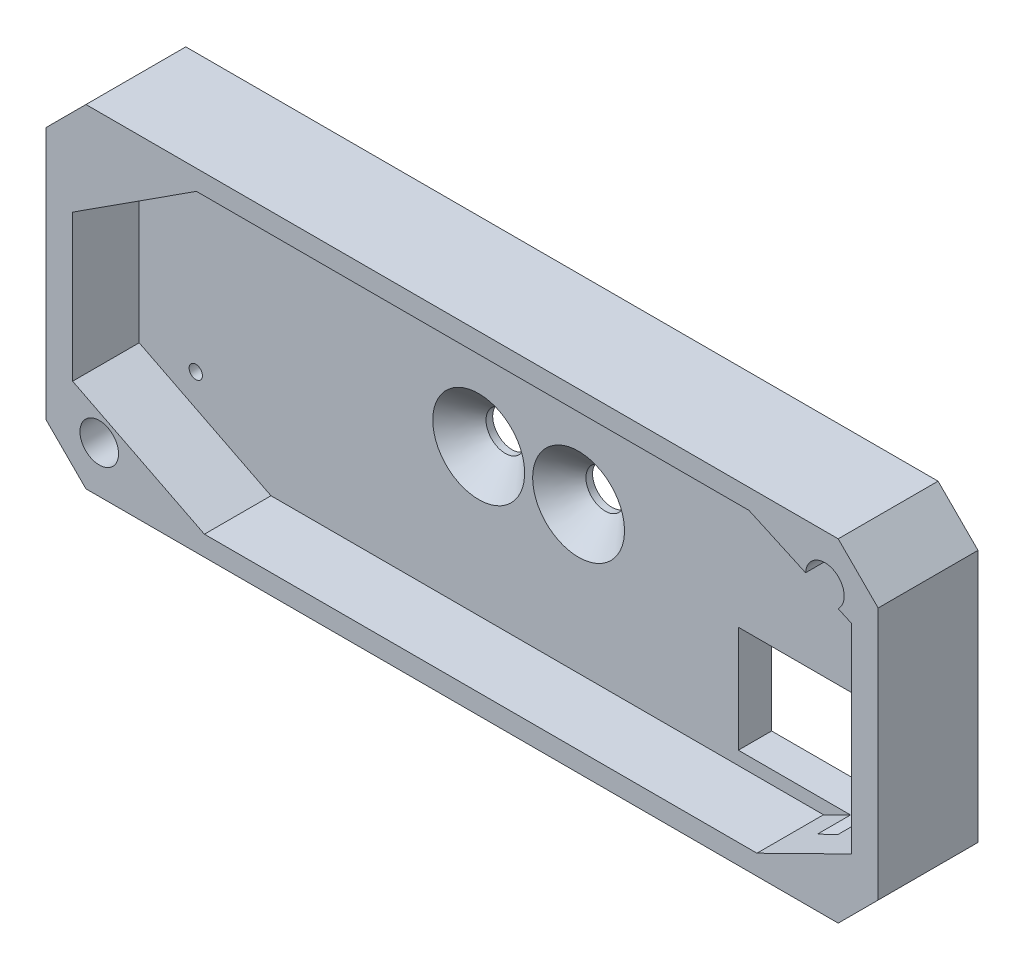
ISO-10303-21;
HEADER;
FILE_DESCRIPTION(('STEP AP214'),'2;1');
FILE_NAME('part.step','',(''),(''),'','','');
FILE_SCHEMA(('AUTOMOTIVE_DESIGN { 1 0 10303 214 1 1 1 1 }'));
ENDSEC;
DATA;
#1=APPLICATION_CONTEXT('core data for automotive mechanical design processes');
#2=APPLICATION_PROTOCOL_DEFINITION('international standard','automotive_design',2000,#1);
#3=PRODUCT_CONTEXT('',#1,'mechanical');
#4=PRODUCT('Part','Part','',(#3));
#5=PRODUCT_RELATED_PRODUCT_CATEGORY('part','',(#4));
#6=PRODUCT_DEFINITION_FORMATION('','',#4);
#7=PRODUCT_DEFINITION_CONTEXT('part definition',#1,'design');
#8=PRODUCT_DEFINITION('design','',#6,#7);
#9=PRODUCT_DEFINITION_SHAPE('','',#8);
#10=(LENGTH_UNIT() NAMED_UNIT(*) SI_UNIT(.MILLI.,.METRE.));
#11=(NAMED_UNIT(*) PLANE_ANGLE_UNIT() SI_UNIT($,.RADIAN.));
#12=(NAMED_UNIT(*) SI_UNIT($,.STERADIAN.) SOLID_ANGLE_UNIT());
#13=UNCERTAINTY_MEASURE_WITH_UNIT(LENGTH_MEASURE(1.E-05),#10,'distance_accuracy_value','');
#14=(GEOMETRIC_REPRESENTATION_CONTEXT(3) GLOBAL_UNCERTAINTY_ASSIGNED_CONTEXT((#13)) GLOBAL_UNIT_ASSIGNED_CONTEXT((#10,
#11,#12)) REPRESENTATION_CONTEXT('',''));
#15=CARTESIAN_POINT('',(0.,0.,0.));
#16=DIRECTION('',(0.,0.,1.));
#17=DIRECTION('',(1.,0.,0.));
#18=AXIS2_PLACEMENT_3D('',#15,#16,#17);
#19=CARTESIAN_POINT('',(21.55,11.,7.5));
#20=DIRECTION('',(-0.413802944301184,-0.910366477462605,0.));
#21=DIRECTION('',(0.910366477462605,-0.413802944301184,0.));
#22=AXIS2_PLACEMENT_3D('',#19,#20,#21);
#23=PLANE('',#22);
#24=DIRECTION('',(0.,0.,1.));
#25=VECTOR('',#24,1.);
#26=CARTESIAN_POINT('',(28.2532240403706,7.95307998164974,-2.5));
#27=LINE('',#26,#25);
#28=CARTESIAN_POINT('',(28.2532240403706,7.95307998164974,2.5));
#29=VERTEX_POINT('',#28);
#30=CARTESIAN_POINT('',(28.2532240403706,7.95307998164974,7.5));
#31=VERTEX_POINT('',#30);
#32=EDGE_CURVE('E11',#29,#31,#27,.T.);
#33=ORIENTED_EDGE('',*,*,#32,.F.);
#34=DIRECTION('',(-0.910366477462605,0.413802944301184,0.));
#35=VECTOR('',#34,1.);
#36=CARTESIAN_POINT('',(21.55,11.,2.5));
#37=LINE('',#36,#35);
#38=CARTESIAN_POINT('',(29.25,7.5,2.5));
#39=VERTEX_POINT('',#38);
#40=EDGE_CURVE('E255',#39,#29,#37,.T.);
#41=ORIENTED_EDGE('',*,*,#40,.F.);
#42=DIRECTION('',(0.,0.,-1.));
#43=VECTOR('',#42,1.);
#44=CARTESIAN_POINT('',(29.25,7.5,7.5));
#45=LINE('',#44,#43);
#46=CARTESIAN_POINT('',(29.25,7.5,7.5));
#47=VERTEX_POINT('',#46);
#48=EDGE_CURVE('E226',#47,#39,#45,.T.);
#49=ORIENTED_EDGE('',*,*,#48,.F.);
#50=DIRECTION('',(-0.910366477462605,0.413802944301184,0.));
#51=VECTOR('',#50,1.);
#52=CARTESIAN_POINT('',(21.55,11.,7.5));
#53=LINE('',#52,#51);
#54=EDGE_CURVE('E219',#47,#31,#53,.T.);
#55=ORIENTED_EDGE('',*,*,#54,.T.);
#56=EDGE_LOOP('',(#33,#41,#49,#55));
#57=FACE_BOUND('',#56,.T.);
#58=ADVANCED_FACE('F47',(#57),#23,.T.);
#59=CARTESIAN_POINT('',(31.25,-12.5,2.5));
#60=DIRECTION('',(-1.,0.,0.));
#61=DIRECTION('',(0.,0.,1.));
#62=AXIS2_PLACEMENT_3D('',#59,#60,#61);
#63=PLANE('',#62);
#64=DIRECTION('',(0.,0.,1.));
#65=VECTOR('',#64,1.);
#66=CARTESIAN_POINT('',(31.25,9.49999999999999,-2.5));
#67=LINE('',#66,#65);
#68=CARTESIAN_POINT('',(31.25,9.49999999999999,0.));
#69=VERTEX_POINT('',#68);
#70=CARTESIAN_POINT('',(31.25,9.49999999999999,7.5));
#71=VERTEX_POINT('',#70);
#72=EDGE_CURVE('E456',#69,#71,#67,.T.);
#73=ORIENTED_EDGE('',*,*,#72,.T.);
#74=DIRECTION('',(0.,1.,0.));
#75=VECTOR('',#74,1.);
#76=CARTESIAN_POINT('',(31.25,12.5,7.5));
#77=LINE('',#76,#75);
#78=CARTESIAN_POINT('',(31.25,-9.49999999999999,7.5));
#79=VERTEX_POINT('',#78);
#80=EDGE_CURVE('E290',#79,#71,#77,.T.);
#81=ORIENTED_EDGE('',*,*,#80,.F.);
#82=DIRECTION('',(0.,0.,1.));
#83=VECTOR('',#82,1.);
#84=CARTESIAN_POINT('',(31.25,-9.49999999999999,-2.5));
#85=LINE('',#84,#83);
#86=CARTESIAN_POINT('',(31.25,-9.49999999999999,0.));
#87=VERTEX_POINT('',#86);
#88=EDGE_CURVE('E454',#87,#79,#85,.T.);
#89=ORIENTED_EDGE('',*,*,#88,.F.);
#90=DIRECTION('',(0.,1.,0.));
#91=VECTOR('',#90,1.);
#92=CARTESIAN_POINT('',(31.25,-12.5,0.));
#93=LINE('',#92,#91);
#94=EDGE_CURVE('E297',#87,#69,#93,.T.);
#95=ORIENTED_EDGE('',*,*,#94,.T.);
#96=EDGE_LOOP('',(#73,#81,#89,#95));
#97=FACE_BOUND('',#96,.T.);
#98=ADVANCED_FACE('F511',(#97),#63,.F.);
#99=CARTESIAN_POINT('',(-31.25,12.5,2.5));
#100=DIRECTION('',(0.,-1.,0.));
#101=DIRECTION('',(0.,0.,-1.));
#102=AXIS2_PLACEMENT_3D('',#99,#100,#101);
#103=PLANE('',#102);
#104=DIRECTION('',(0.,0.,1.));
#105=VECTOR('',#104,1.);
#106=CARTESIAN_POINT('',(28.25,12.5,-2.5));
#107=LINE('',#106,#105);
#108=CARTESIAN_POINT('',(28.25,12.5,0.));
#109=VERTEX_POINT('',#108);
#110=CARTESIAN_POINT('',(28.25,12.5,7.5));
#111=VERTEX_POINT('',#110);
#112=EDGE_CURVE('E70',#109,#111,#107,.T.);
#113=ORIENTED_EDGE('',*,*,#112,.F.);
#114=DIRECTION('',(-1.,0.,0.));
#115=VECTOR('',#114,1.);
#116=CARTESIAN_POINT('',(-31.25,12.5,0.));
#117=LINE('',#116,#115);
#118=CARTESIAN_POINT('',(-28.25,12.5,0.));
#119=VERTEX_POINT('',#118);
#120=EDGE_CURVE('E300',#109,#119,#117,.T.);
#121=ORIENTED_EDGE('',*,*,#120,.T.);
#122=DIRECTION('',(0.,0.,1.));
#123=VECTOR('',#122,1.);
#124=CARTESIAN_POINT('',(-28.25,12.5,-2.5));
#125=LINE('',#124,#123);
#126=CARTESIAN_POINT('',(-28.25,12.5,7.5));
#127=VERTEX_POINT('',#126);
#128=EDGE_CURVE('E440',#119,#127,#125,.T.);
#129=ORIENTED_EDGE('',*,*,#128,.T.);
#130=DIRECTION('',(-1.,0.,0.));
#131=VECTOR('',#130,1.);
#132=CARTESIAN_POINT('',(-31.25,12.5,7.5));
#133=LINE('',#132,#131);
#134=EDGE_CURVE('E293',#111,#127,#133,.T.);
#135=ORIENTED_EDGE('',*,*,#134,.F.);
#136=EDGE_LOOP('',(#113,#121,#129,#135));
#137=FACE_BOUND('',#136,.T.);
#138=ADVANCED_FACE('F518',(#137),#103,.F.);
#139=CARTESIAN_POINT('',(-31.25,-12.5,2.5));
#140=DIRECTION('',(1.,0.,0.));
#141=DIRECTION('',(0.,0.,-1.));
#142=AXIS2_PLACEMENT_3D('',#139,#140,#141);
#143=PLANE('',#142);
#144=DIRECTION('',(0.,0.,1.));
#145=VECTOR('',#144,1.);
#146=CARTESIAN_POINT('',(-31.25,-9.5,-2.5));
#147=LINE('',#146,#145);
#148=CARTESIAN_POINT('',(-31.25,-9.5,0.));
#149=VERTEX_POINT('',#148);
#150=CARTESIAN_POINT('',(-31.25,-9.5,7.5));
#151=VERTEX_POINT('',#150);
#152=EDGE_CURVE('E446',#149,#151,#147,.T.);
#153=ORIENTED_EDGE('',*,*,#152,.T.);
#154=DIRECTION('',(0.,-1.,0.));
#155=VECTOR('',#154,1.);
#156=CARTESIAN_POINT('',(-31.25,12.5,7.5));
#157=LINE('',#156,#155);
#158=CARTESIAN_POINT('',(-31.25,9.49999999999998,7.5));
#159=VERTEX_POINT('',#158);
#160=EDGE_CURVE('E284',#159,#151,#157,.T.);
#161=ORIENTED_EDGE('',*,*,#160,.F.);
#162=DIRECTION('',(0.,0.,1.));
#163=VECTOR('',#162,1.);
#164=CARTESIAN_POINT('',(-31.25,9.49999999999999,-2.5));
#165=LINE('',#164,#163);
#166=CARTESIAN_POINT('',(-31.25,9.49999999999999,0.));
#167=VERTEX_POINT('',#166);
#168=EDGE_CURVE('E443',#167,#159,#165,.T.);
#169=ORIENTED_EDGE('',*,*,#168,.F.);
#170=DIRECTION('',(0.,-1.,0.));
#171=VECTOR('',#170,1.);
#172=CARTESIAN_POINT('',(-31.25,-12.5,0.));
#173=LINE('',#172,#171);
#174=EDGE_CURVE('E304',#167,#149,#173,.T.);
#175=ORIENTED_EDGE('',*,*,#174,.T.);
#176=EDGE_LOOP('',(#153,#161,#169,#175));
#177=FACE_BOUND('',#176,.T.);
#178=ADVANCED_FACE('F555',(#177),#143,.F.);
#179=CARTESIAN_POINT('',(-31.25,-12.5,2.5));
#180=DIRECTION('',(0.,1.,0.));
#181=DIRECTION('',(0.,0.,1.));
#182=AXIS2_PLACEMENT_3D('',#179,#180,#181);
#183=PLANE('',#182);
#184=DIRECTION('',(0.,0.,1.));
#185=VECTOR('',#184,1.);
#186=CARTESIAN_POINT('',(28.25,-12.5,-2.5));
#187=LINE('',#186,#185);
#188=CARTESIAN_POINT('',(28.25,-12.5,0.));
#189=VERTEX_POINT('',#188);
#190=CARTESIAN_POINT('',(28.25,-12.5,7.5));
#191=VERTEX_POINT('',#190);
#192=EDGE_CURVE('E451',#189,#191,#187,.T.);
#193=ORIENTED_EDGE('',*,*,#192,.T.);
#194=DIRECTION('',(1.,0.,0.));
#195=VECTOR('',#194,1.);
#196=CARTESIAN_POINT('',(-31.25,-12.5,7.5));
#197=LINE('',#196,#195);
#198=CARTESIAN_POINT('',(-28.25,-12.5,7.5));
#199=VERTEX_POINT('',#198);
#200=EDGE_CURVE('E287',#199,#191,#197,.T.);
#201=ORIENTED_EDGE('',*,*,#200,.F.);
#202=DIRECTION('',(0.,0.,1.));
#203=VECTOR('',#202,1.);
#204=CARTESIAN_POINT('',(-28.25,-12.5,-2.5));
#205=LINE('',#204,#203);
#206=CARTESIAN_POINT('',(-28.25,-12.5,0.));
#207=VERTEX_POINT('',#206);
#208=EDGE_CURVE('E449',#207,#199,#205,.T.);
#209=ORIENTED_EDGE('',*,*,#208,.F.);
#210=DIRECTION('',(1.,0.,0.));
#211=VECTOR('',#210,1.);
#212=CARTESIAN_POINT('',(-31.25,-12.5,0.));
#213=LINE('',#212,#211);
#214=EDGE_CURVE('E307',#207,#189,#213,.T.);
#215=ORIENTED_EDGE('',*,*,#214,.T.);
#216=EDGE_LOOP('',(#193,#201,#209,#215));
#217=FACE_BOUND('',#216,.T.);
#218=ADVANCED_FACE('F551',(#217),#183,.F.);
#219=CARTESIAN_POINT('',(0.,0.,0.));
#220=DIRECTION('',(0.,0.,-1.));
#221=DIRECTION('',(-1.,0.,0.));
#222=AXIS2_PLACEMENT_3D('',#219,#220,#221);
#223=PLANE('',#222);
#224=CARTESIAN_POINT('',(-25.,-5.76608563525223,0.));
#225=DIRECTION('',(0.,0.,-1.));
#226=DIRECTION('',(-1.,0.,0.));
#227=AXIS2_PLACEMENT_3D('',#224,#225,#226);
#228=CIRCLE('',#227,0.499999999999999);
#229=CARTESIAN_POINT('',(-25.5,-5.76608563525223,0.));
#230=VERTEX_POINT('',#229);
#231=EDGE_CURVE('E223',#230,#230,#228,.T.);
#232=ORIENTED_EDGE('',*,*,#231,.F.);
#233=EDGE_LOOP('',(#232));
#234=FACE_BOUND('',#233,.T.);
#235=CARTESIAN_POINT('',(26.5479589711327,6.00000000000001,0.));
#236=DIRECTION('',(0.,0.,-1.));
#237=DIRECTION('',(-1.,0.,0.));
#238=AXIS2_PLACEMENT_3D('',#235,#236,#237);
#239=CIRCLE('',#238,0.499999999999999);
#240=CARTESIAN_POINT('',(26.0479589711327,6.00000000000001,0.));
#241=VERTEX_POINT('',#240);
#242=EDGE_CURVE('E479',#241,#241,#239,.T.);
#243=ORIENTED_EDGE('',*,*,#242,.F.);
#244=EDGE_LOOP('',(#243));
#245=FACE_BOUND('',#244,.T.);
#246=CARTESIAN_POINT('',(-27.25,-9.,0.));
#247=DIRECTION('',(0.,0.,-1.));
#248=DIRECTION('',(-1.,0.,0.));
#249=AXIS2_PLACEMENT_3D('',#246,#247,#248);
#250=CIRCLE('',#249,1.45);
#251=CARTESIAN_POINT('',(-28.7,-9.,0.));
#252=VERTEX_POINT('',#251);
#253=EDGE_CURVE('E470',#252,#252,#250,.T.);
#254=ORIENTED_EDGE('',*,*,#253,.F.);
#255=EDGE_LOOP('',(#254));
#256=FACE_BOUND('',#255,.T.);
#257=CARTESIAN_POINT('',(27.25,9.,0.));
#258=DIRECTION('',(0.,0.,-1.));
#259=DIRECTION('',(-1.,0.,0.));
#260=AXIS2_PLACEMENT_3D('',#257,#258,#259);
#261=CIRCLE('',#260,1.45);
#262=CARTESIAN_POINT('',(25.8,9.,0.));
#263=VERTEX_POINT('',#262);
#264=EDGE_CURVE('E337',#263,#263,#261,.T.);
#265=ORIENTED_EDGE('',*,*,#264,.F.);
#266=EDGE_LOOP('',(#265));
#267=FACE_BOUND('',#266,.T.);
#268=DIRECTION('',(0.,1.,0.));
#269=VECTOR('',#268,1.);
#270=CARTESIAN_POINT('',(15.75,-2.,0.));
#271=LINE('',#270,#269);
#272=CARTESIAN_POINT('',(15.75,-10.,0.));
#273=VERTEX_POINT('',#272);
#274=CARTESIAN_POINT('',(15.75,-2.,0.));
#275=VERTEX_POINT('',#274);
#276=EDGE_CURVE('E424',#273,#275,#271,.T.);
#277=ORIENTED_EDGE('',*,*,#276,.F.);
#278=DIRECTION('',(-1.,0.,0.));
#279=VECTOR('',#278,1.);
#280=CARTESIAN_POINT('',(15.75,-10.,0.));
#281=LINE('',#280,#279);
#282=CARTESIAN_POINT('',(25.75,-10.,0.));
#283=VERTEX_POINT('',#282);
#284=EDGE_CURVE('E418',#283,#273,#281,.T.);
#285=ORIENTED_EDGE('',*,*,#284,.F.);
#286=DIRECTION('',(0.,-1.,0.));
#287=VECTOR('',#286,1.);
#288=CARTESIAN_POINT('',(25.75,-2.,0.));
#289=LINE('',#288,#287);
#290=CARTESIAN_POINT('',(25.75,-2.,0.));
#291=VERTEX_POINT('',#290);
#292=EDGE_CURVE('E421',#291,#283,#289,.T.);
#293=ORIENTED_EDGE('',*,*,#292,.F.);
#294=DIRECTION('',(1.,0.,0.));
#295=VECTOR('',#294,1.);
#296=CARTESIAN_POINT('',(15.75,-2.,0.));
#297=LINE('',#296,#295);
#298=EDGE_CURVE('E410',#275,#291,#297,.T.);
#299=ORIENTED_EDGE('',*,*,#298,.F.);
#300=EDGE_LOOP('',(#277,#285,#293,#299));
#301=FACE_BOUND('',#300,.T.);
#302=CARTESIAN_POINT('',(3.75,0.,0.));
#303=DIRECTION('',(0.,0.,-1.));
#304=DIRECTION('',(-1.,0.,0.));
#305=AXIS2_PLACEMENT_3D('',#302,#303,#304);
#306=CIRCLE('',#305,1.45);
#307=CARTESIAN_POINT('',(2.3,0.,0.));
#308=VERTEX_POINT('',#307);
#309=EDGE_CURVE('E301',#308,#308,#306,.T.);
#310=ORIENTED_EDGE('',*,*,#309,.F.);
#311=EDGE_LOOP('',(#310));
#312=FACE_BOUND('',#311,.T.);
#313=CARTESIAN_POINT('',(-3.75,0.,0.));
#314=DIRECTION('',(0.,0.,-1.));
#315=DIRECTION('',(-1.,0.,0.));
#316=AXIS2_PLACEMENT_3D('',#313,#314,#315);
#317=CIRCLE('',#316,1.45);
#318=CARTESIAN_POINT('',(-5.2,0.,0.));
#319=VERTEX_POINT('',#318);
#320=EDGE_CURVE('E296',#319,#319,#317,.T.);
#321=ORIENTED_EDGE('',*,*,#320,.F.);
#322=EDGE_LOOP('',(#321));
#323=FACE_BOUND('',#322,.T.);
#324=ORIENTED_EDGE('',*,*,#120,.F.);
#325=DIRECTION('',(0.707106781186546,-0.707106781186549,0.));
#326=VECTOR('',#325,1.);
#327=CARTESIAN_POINT('',(20.375,20.375,0.));
#328=LINE('',#327,#326);
#329=EDGE_CURVE('E426',#109,#69,#328,.T.);
#330=ORIENTED_EDGE('',*,*,#329,.T.);
#331=ORIENTED_EDGE('',*,*,#94,.F.);
#332=DIRECTION('',(-0.707106781186546,-0.707106781186549,0.));
#333=VECTOR('',#332,1.);
#334=CARTESIAN_POINT('',(20.3750000000001,-20.375,0.));
#335=LINE('',#334,#333);
#336=EDGE_CURVE('E431',#87,#189,#335,.T.);
#337=ORIENTED_EDGE('',*,*,#336,.T.);
#338=ORIENTED_EDGE('',*,*,#214,.F.);
#339=DIRECTION('',(-0.707106781186547,0.707106781186548,0.));
#340=VECTOR('',#339,1.);
#341=CARTESIAN_POINT('',(-20.375,-20.375,0.));
#342=LINE('',#341,#340);
#343=EDGE_CURVE('E434',#207,#149,#342,.T.);
#344=ORIENTED_EDGE('',*,*,#343,.T.);
#345=ORIENTED_EDGE('',*,*,#174,.F.);
#346=DIRECTION('',(0.707106781186545,0.70710678118655,0.));
#347=VECTOR('',#346,1.);
#348=CARTESIAN_POINT('',(-20.3750000000001,20.375,0.));
#349=LINE('',#348,#347);
#350=EDGE_CURVE('E437',#167,#119,#349,.T.);
#351=ORIENTED_EDGE('',*,*,#350,.T.);
#352=EDGE_LOOP('',(#324,#330,#331,#337,#338,#344,#345,#351));
#353=FACE_BOUND('',#352,.T.);
#354=ADVANCED_FACE('F539',(#234,#245,#256,#267,#301,#312,#323,#353),#223,.T.);
#355=CARTESIAN_POINT('',(0.,0.,7.5));
#356=DIRECTION('',(0.,0.,1.));
#357=DIRECTION('',(1.,0.,0.));
#358=AXIS2_PLACEMENT_3D('',#355,#356,#357);
#359=PLANE('',#358);
#360=CARTESIAN_POINT('',(-27.25,-9.,7.5));
#361=DIRECTION('',(0.,0.,1.));
#362=DIRECTION('',(1.,0.,0.));
#363=AXIS2_PLACEMENT_3D('',#360,#361,#362);
#364=CIRCLE('',#363,1.45);
#365=CARTESIAN_POINT('',(-25.8,-9.,7.5));
#366=VERTEX_POINT('',#365);
#367=EDGE_CURVE('E222',#366,#366,#364,.T.);
#368=ORIENTED_EDGE('',*,*,#367,.F.);
#369=EDGE_LOOP('',(#368));
#370=FACE_BOUND('',#369,.T.);
#371=CARTESIAN_POINT('',(27.25,9.,7.5));
#372=DIRECTION('',(0.,0.,1.));
#373=DIRECTION('',(1.,0.,0.));
#374=AXIS2_PLACEMENT_3D('',#371,#372,#373);
#375=CIRCLE('',#374,1.45);
#376=CARTESIAN_POINT('',(25.8015704801774,9.06746796355574,7.5));
#377=VERTEX_POINT('',#376);
#378=EDGE_CURVE('E62',#31,#377,#375,.T.);
#379=ORIENTED_EDGE('',*,*,#378,.F.);
#380=ORIENTED_EDGE('',*,*,#54,.F.);
#381=DIRECTION('',(0.,1.,0.));
#382=VECTOR('',#381,1.);
#383=CARTESIAN_POINT('',(29.25,7.5,7.5));
#384=LINE('',#383,#382);
#385=CARTESIAN_POINT('',(29.25,-7.5,7.5));
#386=VERTEX_POINT('',#385);
#387=EDGE_CURVE('E231',#386,#47,#384,.T.);
#388=ORIENTED_EDGE('',*,*,#387,.F.);
#389=DIRECTION('',(0.896989897320621,0.44205104242015,0.));
#390=VECTOR('',#389,1.);
#391=CARTESIAN_POINT('',(29.25,-7.5,7.5));
#392=LINE('',#391,#390);
#393=CARTESIAN_POINT('',(22.14795897,-11.,7.5));
#394=VERTEX_POINT('',#393);
#395=EDGE_CURVE('E392',#394,#386,#392,.T.);
#396=ORIENTED_EDGE('',*,*,#395,.F.);
#397=DIRECTION('',(1.,0.,0.));
#398=VECTOR('',#397,1.);
#399=CARTESIAN_POINT('',(22.14795897,-11.,7.5));
#400=LINE('',#399,#398);
#401=CARTESIAN_POINT('',(-19.35204103,-11.,7.5));
#402=VERTEX_POINT('',#401);
#403=EDGE_CURVE('E365',#402,#394,#400,.T.);
#404=ORIENTED_EDGE('',*,*,#403,.F.);
#405=DIRECTION('',(0.892579243993913,-0.450890555668728,0.));
#406=VECTOR('',#405,1.);
#407=CARTESIAN_POINT('',(-19.35204103,-11.,7.5));
#408=LINE('',#407,#406);
#409=CARTESIAN_POINT('',(-29.25,-6.,7.5));
#410=VERTEX_POINT('',#409);
#411=EDGE_CURVE('E266',#410,#402,#408,.T.);
#412=ORIENTED_EDGE('',*,*,#411,.F.);
#413=DIRECTION('',(0.,-1.,0.));
#414=VECTOR('',#413,1.);
#415=CARTESIAN_POINT('',(-29.25,-6.,7.5));
#416=LINE('',#415,#414);
#417=CARTESIAN_POINT('',(-29.25,5.,7.5));
#418=VERTEX_POINT('',#417);
#419=EDGE_CURVE('E237',#418,#410,#416,.T.);
#420=ORIENTED_EDGE('',*,*,#419,.F.);
#421=DIRECTION('',(-0.840296648224244,-0.542126869822093,0.));
#422=VECTOR('',#421,1.);
#423=CARTESIAN_POINT('',(-29.25,5.,7.5));
#424=LINE('',#423,#422);
#425=CARTESIAN_POINT('',(-19.95,11.,7.5));
#426=VERTEX_POINT('',#425);
#427=EDGE_CURVE('E229',#426,#418,#424,.T.);
#428=ORIENTED_EDGE('',*,*,#427,.F.);
#429=DIRECTION('',(-1.,0.,0.));
#430=VECTOR('',#429,1.);
#431=CARTESIAN_POINT('',(-19.95,11.,7.5));
#432=LINE('',#431,#430);
#433=CARTESIAN_POINT('',(21.55,11.,7.5));
#434=VERTEX_POINT('',#433);
#435=EDGE_CURVE('E227',#434,#426,#432,.T.);
#436=ORIENTED_EDGE('',*,*,#435,.F.);
#437=EDGE_CURVE('E221',#377,#434,#53,.T.);
#438=ORIENTED_EDGE('',*,*,#437,.F.);
#439=EDGE_LOOP('',(#379,#380,#388,#396,#404,#412,#420,#428,#436,#438));
#440=FACE_BOUND('',#439,.T.);
#441=ORIENTED_EDGE('',*,*,#80,.T.);
#442=DIRECTION('',(-0.707106781186546,0.707106781186549,0.));
#443=VECTOR('',#442,1.);
#444=CARTESIAN_POINT('',(31.25,9.49999999999999,7.5));
#445=LINE('',#444,#443);
#446=EDGE_CURVE('E444',#71,#111,#445,.T.);
#447=ORIENTED_EDGE('',*,*,#446,.T.);
#448=ORIENTED_EDGE('',*,*,#134,.T.);
#449=DIRECTION('',(-0.707106781186545,-0.70710678118655,0.));
#450=VECTOR('',#449,1.);
#451=CARTESIAN_POINT('',(-28.25,12.5,7.5));
#452=LINE('',#451,#450);
#453=EDGE_CURVE('E467',#127,#159,#452,.T.);
#454=ORIENTED_EDGE('',*,*,#453,.T.);
#455=ORIENTED_EDGE('',*,*,#160,.T.);
#456=DIRECTION('',(0.707106781186547,-0.707106781186548,0.));
#457=VECTOR('',#456,1.);
#458=CARTESIAN_POINT('',(-31.25,-9.5,7.5));
#459=LINE('',#458,#457);
#460=EDGE_CURVE('E464',#151,#199,#459,.T.);
#461=ORIENTED_EDGE('',*,*,#460,.T.);
#462=ORIENTED_EDGE('',*,*,#200,.T.);
#463=DIRECTION('',(0.707106781186546,0.707106781186549,0.));
#464=VECTOR('',#463,1.);
#465=CARTESIAN_POINT('',(28.25,-12.5,7.5));
#466=LINE('',#465,#464);
#467=EDGE_CURVE('E461',#191,#79,#466,.T.);
#468=ORIENTED_EDGE('',*,*,#467,.T.);
#469=EDGE_LOOP('',(#441,#447,#448,#454,#455,#461,#462,#468));
#470=FACE_BOUND('',#469,.T.);
#471=ADVANCED_FACE('F216',(#370,#440,#470),#359,.T.);
#472=CARTESIAN_POINT('',(0.,0.,2.5));
#473=DIRECTION('',(0.,0.,-1.));
#474=DIRECTION('',(-1.,0.,0.));
#475=AXIS2_PLACEMENT_3D('',#472,#473,#474);
#476=PLANE('',#475);
#477=CARTESIAN_POINT('',(-25.,-5.76608563525223,2.5));
#478=DIRECTION('',(0.,0.,1.));
#479=DIRECTION('',(1.,0.,0.));
#480=AXIS2_PLACEMENT_3D('',#477,#478,#479);
#481=CIRCLE('',#480,0.499999999999999);
#482=CARTESIAN_POINT('',(-24.5,-5.76608563525223,2.5));
#483=VERTEX_POINT('',#482);
#484=EDGE_CURVE('E482',#483,#483,#481,.T.);
#485=ORIENTED_EDGE('',*,*,#484,.F.);
#486=EDGE_LOOP('',(#485));
#487=FACE_BOUND('',#486,.T.);
#488=CARTESIAN_POINT('',(26.5479589711327,6.00000000000001,2.5));
#489=DIRECTION('',(0.,0.,1.));
#490=DIRECTION('',(1.,0.,0.));
#491=AXIS2_PLACEMENT_3D('',#488,#489,#490);
#492=CIRCLE('',#491,0.499999999999999);
#493=CARTESIAN_POINT('',(27.0479589711327,6.00000000000001,2.5));
#494=VERTEX_POINT('',#493);
#495=EDGE_CURVE('E483',#494,#494,#492,.T.);
#496=ORIENTED_EDGE('',*,*,#495,.F.);
#497=EDGE_LOOP('',(#496));
#498=FACE_BOUND('',#497,.T.);
#499=ORIENTED_EDGE('',*,*,#40,.T.);
#500=CARTESIAN_POINT('',(27.25,9.,2.5));
#501=DIRECTION('',(0.,0.,-1.));
#502=DIRECTION('',(-1.,0.,0.));
#503=AXIS2_PLACEMENT_3D('',#500,#501,#502);
#504=CIRCLE('',#503,1.45);
#505=CARTESIAN_POINT('',(25.8015704801774,9.06746796355574,2.5));
#506=VERTEX_POINT('',#505);
#507=EDGE_CURVE('E208',#29,#506,#504,.T.);
#508=ORIENTED_EDGE('',*,*,#507,.T.);
#509=CARTESIAN_POINT('',(21.55,11.,2.5));
#510=VERTEX_POINT('',#509);
#511=EDGE_CURVE('E254',#506,#510,#37,.T.);
#512=ORIENTED_EDGE('',*,*,#511,.T.);
#513=DIRECTION('',(-1.,0.,0.));
#514=VECTOR('',#513,1.);
#515=CARTESIAN_POINT('',(-19.95,11.,2.5));
#516=LINE('',#515,#514);
#517=CARTESIAN_POINT('',(-19.95,11.,2.5));
#518=VERTEX_POINT('',#517);
#519=EDGE_CURVE('E257',#510,#518,#516,.T.);
#520=ORIENTED_EDGE('',*,*,#519,.T.);
#521=DIRECTION('',(-0.840296648224244,-0.542126869822093,0.));
#522=VECTOR('',#521,1.);
#523=CARTESIAN_POINT('',(-29.25,5.,2.5));
#524=LINE('',#523,#522);
#525=CARTESIAN_POINT('',(-29.25,5.,2.5));
#526=VERTEX_POINT('',#525);
#527=EDGE_CURVE('E260',#518,#526,#524,.T.);
#528=ORIENTED_EDGE('',*,*,#527,.T.);
#529=DIRECTION('',(0.,-1.,0.));
#530=VECTOR('',#529,1.);
#531=CARTESIAN_POINT('',(-29.25,-6.,2.5));
#532=LINE('',#531,#530);
#533=CARTESIAN_POINT('',(-29.25,-6.,2.5));
#534=VERTEX_POINT('',#533);
#535=EDGE_CURVE('E263',#526,#534,#532,.T.);
#536=ORIENTED_EDGE('',*,*,#535,.T.);
#537=DIRECTION('',(0.892579243993913,-0.450890555668728,0.));
#538=VECTOR('',#537,1.);
#539=CARTESIAN_POINT('',(-19.35204103,-11.,2.5));
#540=LINE('',#539,#538);
#541=CARTESIAN_POINT('',(-19.35204103,-11.,2.5));
#542=VERTEX_POINT('',#541);
#543=EDGE_CURVE('E240',#534,#542,#540,.T.);
#544=ORIENTED_EDGE('',*,*,#543,.T.);
#545=DIRECTION('',(1.,0.,0.));
#546=VECTOR('',#545,1.);
#547=CARTESIAN_POINT('',(22.14795897,-11.,2.5));
#548=LINE('',#547,#546);
#549=CARTESIAN_POINT('',(22.14795897,-11.,2.5));
#550=VERTEX_POINT('',#549);
#551=EDGE_CURVE('E243',#542,#550,#548,.T.);
#552=ORIENTED_EDGE('',*,*,#551,.T.);
#553=DIRECTION('',(0.896989897320621,0.44205104242015,0.));
#554=VECTOR('',#553,1.);
#555=CARTESIAN_POINT('',(29.25,-7.5,2.5));
#556=LINE('',#555,#554);
#557=CARTESIAN_POINT('',(24.17711355,-10.,2.5));
#558=VERTEX_POINT('',#557);
#559=EDGE_CURVE('E248',#550,#558,#556,.T.);
#560=ORIENTED_EDGE('',*,*,#559,.T.);
#561=DIRECTION('',(-1.,0.,0.));
#562=VECTOR('',#561,1.);
#563=CARTESIAN_POINT('',(0.,-10.,2.5));
#564=LINE('',#563,#562);
#565=CARTESIAN_POINT('',(15.75,-10.,2.5));
#566=VERTEX_POINT('',#565);
#567=EDGE_CURVE('E377',#558,#566,#564,.T.);
#568=ORIENTED_EDGE('',*,*,#567,.T.);
#569=DIRECTION('',(0.,1.,0.));
#570=VECTOR('',#569,1.);
#571=CARTESIAN_POINT('',(15.75,0.,2.5));
#572=LINE('',#571,#570);
#573=CARTESIAN_POINT('',(15.75,-2.,2.5));
#574=VERTEX_POINT('',#573);
#575=EDGE_CURVE('E244',#566,#574,#572,.T.);
#576=ORIENTED_EDGE('',*,*,#575,.T.);
#577=DIRECTION('',(1.,0.,0.));
#578=VECTOR('',#577,1.);
#579=CARTESIAN_POINT('',(0.,-2.,2.5));
#580=LINE('',#579,#578);
#581=CARTESIAN_POINT('',(25.75,-2.,2.5));
#582=VERTEX_POINT('',#581);
#583=EDGE_CURVE('E381',#574,#582,#580,.T.);
#584=ORIENTED_EDGE('',*,*,#583,.T.);
#585=DIRECTION('',(0.,-1.,0.));
#586=VECTOR('',#585,1.);
#587=CARTESIAN_POINT('',(25.75,0.,2.5));
#588=LINE('',#587,#586);
#589=CARTESIAN_POINT('',(25.75,-9.2248562699447,2.5));
#590=VERTEX_POINT('',#589);
#591=EDGE_CURVE('E382',#582,#590,#588,.T.);
#592=ORIENTED_EDGE('',*,*,#591,.T.);
#593=CARTESIAN_POINT('',(29.25,-7.5,2.5));
#594=VERTEX_POINT('',#593);
#595=EDGE_CURVE('E247',#590,#594,#556,.T.);
#596=ORIENTED_EDGE('',*,*,#595,.T.);
#597=DIRECTION('',(0.,1.,0.));
#598=VECTOR('',#597,1.);
#599=CARTESIAN_POINT('',(29.25,7.5,2.5));
#600=LINE('',#599,#598);
#601=EDGE_CURVE('E251',#594,#39,#600,.T.);
#602=ORIENTED_EDGE('',*,*,#601,.T.);
#603=EDGE_LOOP('',(#499,#508,#512,#520,#528,#536,#544,#552,#560,#568,#576,#584,#592,#596,#602));
#604=FACE_BOUND('',#603,.T.);
#605=CARTESIAN_POINT('',(-3.75,0.,2.5));
#606=DIRECTION('',(0.,0.,-1.));
#607=DIRECTION('',(-1.,0.,0.));
#608=AXIS2_PLACEMENT_3D('',#605,#606,#607);
#609=CIRCLE('',#608,3.45000000000001);
#610=CARTESIAN_POINT('',(-7.20000000000001,0.,2.5));
#611=VERTEX_POINT('',#610);
#612=EDGE_CURVE('E320',#611,#611,#609,.T.);
#613=ORIENTED_EDGE('',*,*,#612,.T.);
#614=EDGE_LOOP('',(#613));
#615=FACE_BOUND('',#614,.T.);
#616=CARTESIAN_POINT('',(3.75,0.,2.5));
#617=DIRECTION('',(0.,0.,-1.));
#618=DIRECTION('',(-1.,0.,0.));
#619=AXIS2_PLACEMENT_3D('',#616,#617,#618);
#620=CIRCLE('',#619,3.45000000000002);
#621=CARTESIAN_POINT('',(0.299999999999977,0.,2.5));
#622=VERTEX_POINT('',#621);
#623=EDGE_CURVE('E317',#622,#622,#620,.T.);
#624=ORIENTED_EDGE('',*,*,#623,.T.);
#625=EDGE_LOOP('',(#624));
#626=FACE_BOUND('',#625,.T.);
#627=ADVANCED_FACE('F335',(#487,#498,#604,#615,#626),#476,.F.);
#628=CARTESIAN_POINT('',(-3.75,0.,-1.));
#629=DIRECTION('',(0.,0.,1.));
#630=DIRECTION('',(1.,0.,0.));
#631=AXIS2_PLACEMENT_3D('',#628,#629,#630);
#632=CYLINDRICAL_SURFACE('',#631,1.45);
#633=CARTESIAN_POINT('',(-3.75,0.,0.499999999999993));
#634=DIRECTION('',(0.,0.,-1.));
#635=DIRECTION('',(-1.,0.,0.));
#636=AXIS2_PLACEMENT_3D('',#633,#634,#635);
#637=CIRCLE('',#636,1.45);
#638=CARTESIAN_POINT('',(-5.2,0.,0.499999999999993));
#639=VERTEX_POINT('',#638);
#640=EDGE_CURVE('E310',#639,#639,#637,.F.);
#641=ORIENTED_EDGE('',*,*,#640,.T.);
#642=EDGE_LOOP('',(#641));
#643=FACE_BOUND('',#642,.T.);
#644=ORIENTED_EDGE('',*,*,#320,.T.);
#645=EDGE_LOOP('',(#644));
#646=FACE_BOUND('',#645,.T.);
#647=ADVANCED_FACE('F493',(#643,#646),#632,.F.);
#648=CARTESIAN_POINT('',(3.75,0.,-1.));
#649=DIRECTION('',(0.,0.,1.));
#650=DIRECTION('',(1.,0.,0.));
#651=AXIS2_PLACEMENT_3D('',#648,#649,#650);
#652=CYLINDRICAL_SURFACE('',#651,1.45);
#653=CARTESIAN_POINT('',(3.75,0.,0.499999999999987));
#654=DIRECTION('',(0.,0.,-1.));
#655=DIRECTION('',(-1.,0.,0.));
#656=AXIS2_PLACEMENT_3D('',#653,#654,#655);
#657=CIRCLE('',#656,1.45);
#658=CARTESIAN_POINT('',(2.3,0.,0.499999999999987));
#659=VERTEX_POINT('',#658);
#660=EDGE_CURVE('E323',#659,#659,#657,.F.);
#661=ORIENTED_EDGE('',*,*,#660,.T.);
#662=EDGE_LOOP('',(#661));
#663=FACE_BOUND('',#662,.T.);
#664=ORIENTED_EDGE('',*,*,#309,.T.);
#665=EDGE_LOOP('',(#664));
#666=FACE_BOUND('',#665,.T.);
#667=ADVANCED_FACE('F541',(#663,#666),#652,.F.);
#668=CARTESIAN_POINT('',(-3.75,0.,0.499999999999993));
#669=DIRECTION('',(0.,0.,1.));
#670=DIRECTION('',(1.,0.,0.));
#671=AXIS2_PLACEMENT_3D('',#668,#669,#670);
#672=CONICAL_SURFACE('',#671,1.45,0.785398163397449);
#673=ORIENTED_EDGE('',*,*,#612,.F.);
#674=EDGE_LOOP('',(#673));
#675=FACE_BOUND('',#674,.T.);
#676=ORIENTED_EDGE('',*,*,#640,.F.);
#677=EDGE_LOOP('',(#676));
#678=FACE_BOUND('',#677,.T.);
#679=ADVANCED_FACE('F544',(#675,#678),#672,.F.);
#680=CARTESIAN_POINT('',(3.75,0.,0.499999999999987));
#681=DIRECTION('',(0.,0.,1.));
#682=DIRECTION('',(1.,0.,0.));
#683=AXIS2_PLACEMENT_3D('',#680,#681,#682);
#684=CONICAL_SURFACE('',#683,1.45,0.78539816339745);
#685=ORIENTED_EDGE('',*,*,#623,.F.);
#686=EDGE_LOOP('',(#685));
#687=FACE_BOUND('',#686,.T.);
#688=ORIENTED_EDGE('',*,*,#660,.F.);
#689=EDGE_LOOP('',(#688));
#690=FACE_BOUND('',#689,.T.);
#691=ADVANCED_FACE('F50',(#687,#690),#684,.F.);
#692=CARTESIAN_POINT('',(-19.35204103,-11.,7.5));
#693=DIRECTION('',(0.450890555668728,0.892579243993913,0.));
#694=DIRECTION('',(-0.892579243993913,0.450890555668728,0.));
#695=AXIS2_PLACEMENT_3D('',#692,#693,#694);
#696=PLANE('',#695);
#697=ORIENTED_EDGE('',*,*,#543,.F.);
#698=DIRECTION('',(0.,0.,-1.));
#699=VECTOR('',#698,1.);
#700=CARTESIAN_POINT('',(-29.25,-6.,7.5));
#701=LINE('',#700,#699);
#702=EDGE_CURVE('E239',#410,#534,#701,.T.);
#703=ORIENTED_EDGE('',*,*,#702,.F.);
#704=ORIENTED_EDGE('',*,*,#411,.T.);
#705=DIRECTION('',(0.,0.,-1.));
#706=VECTOR('',#705,1.);
#707=CARTESIAN_POINT('',(-19.35204103,-11.,7.5));
#708=LINE('',#707,#706);
#709=EDGE_CURVE('E281',#402,#542,#708,.T.);
#710=ORIENTED_EDGE('',*,*,#709,.T.);
#711=EDGE_LOOP('',(#697,#703,#704,#710));
#712=FACE_BOUND('',#711,.T.);
#713=ADVANCED_FACE('F357',(#712),#696,.T.);
#714=CARTESIAN_POINT('',(22.14795897,-11.,7.5));
#715=DIRECTION('',(0.,1.,0.));
#716=DIRECTION('',(-1.,0.,0.));
#717=AXIS2_PLACEMENT_3D('',#714,#715,#716);
#718=PLANE('',#717);
#719=ORIENTED_EDGE('',*,*,#551,.F.);
#720=ORIENTED_EDGE('',*,*,#709,.F.);
#721=ORIENTED_EDGE('',*,*,#403,.T.);
#722=DIRECTION('',(0.,0.,-1.));
#723=VECTOR('',#722,1.);
#724=CARTESIAN_POINT('',(22.14795897,-11.,7.5));
#725=LINE('',#724,#723);
#726=EDGE_CURVE('E279',#394,#550,#725,.T.);
#727=ORIENTED_EDGE('',*,*,#726,.T.);
#728=EDGE_LOOP('',(#719,#720,#721,#727));
#729=FACE_BOUND('',#728,.T.);
#730=ADVANCED_FACE('F362',(#729),#718,.T.);
#731=CARTESIAN_POINT('',(29.25,-7.5,7.5));
#732=DIRECTION('',(-0.44205104242015,0.896989897320621,0.));
#733=DIRECTION('',(-0.896989897320621,-0.44205104242015,0.));
#734=AXIS2_PLACEMENT_3D('',#731,#732,#733);
#735=PLANE('',#734);
#736=DIRECTION('',(0.,0.,1.));
#737=VECTOR('',#736,1.);
#738=CARTESIAN_POINT('',(24.17711355,-10.,7.5));
#739=LINE('',#738,#737);
#740=CARTESIAN_POINT('',(24.17711355,-10.,5.));
#741=VERTEX_POINT('',#740);
#742=EDGE_CURVE('E330',#558,#741,#739,.T.);
#743=ORIENTED_EDGE('',*,*,#742,.F.);
#744=ORIENTED_EDGE('',*,*,#559,.F.);
#745=ORIENTED_EDGE('',*,*,#726,.F.);
#746=ORIENTED_EDGE('',*,*,#395,.T.);
#747=DIRECTION('',(0.,0.,-1.));
#748=VECTOR('',#747,1.);
#749=CARTESIAN_POINT('',(29.25,-7.5,7.5));
#750=LINE('',#749,#748);
#751=EDGE_CURVE('E276',#386,#594,#750,.T.);
#752=ORIENTED_EDGE('',*,*,#751,.T.);
#753=ORIENTED_EDGE('',*,*,#595,.F.);
#754=DIRECTION('',(0.,0.,-1.));
#755=VECTOR('',#754,1.);
#756=CARTESIAN_POINT('',(25.75,-9.2248562699447,7.5));
#757=LINE('',#756,#755);
#758=CARTESIAN_POINT('',(25.75,-9.2248562699447,5.));
#759=VERTEX_POINT('',#758);
#760=EDGE_CURVE('E328',#759,#590,#757,.T.);
#761=ORIENTED_EDGE('',*,*,#760,.F.);
#762=DIRECTION('',(0.896989897320621,0.44205104242015,0.));
#763=VECTOR('',#762,1.);
#764=CARTESIAN_POINT('',(29.25,-7.5,5.));
#765=LINE('',#764,#763);
#766=EDGE_CURVE('E326',#741,#759,#765,.T.);
#767=ORIENTED_EDGE('',*,*,#766,.F.);
#768=EDGE_LOOP('',(#743,#744,#745,#746,#752,#753,#761,#767));
#769=FACE_BOUND('',#768,.T.);
#770=ADVANCED_FACE('F369',(#769),#735,.T.);
#771=CARTESIAN_POINT('',(29.25,7.5,7.5));
#772=DIRECTION('',(-1.,0.,0.));
#773=DIRECTION('',(0.,-1.,0.));
#774=AXIS2_PLACEMENT_3D('',#771,#772,#773);
#775=PLANE('',#774);
#776=ORIENTED_EDGE('',*,*,#601,.F.);
#777=ORIENTED_EDGE('',*,*,#751,.F.);
#778=ORIENTED_EDGE('',*,*,#387,.T.);
#779=ORIENTED_EDGE('',*,*,#48,.T.);
#780=EDGE_LOOP('',(#776,#777,#778,#779));
#781=FACE_BOUND('',#780,.T.);
#782=ADVANCED_FACE('F396',(#781),#775,.T.);
#783=DIRECTION('',(0.,0.,1.));
#784=VECTOR('',#783,1.);
#785=CARTESIAN_POINT('',(25.8015704801774,9.06746796355574,-2.5));
#786=LINE('',#785,#784);
#787=EDGE_CURVE('E56',#377,#506,#786,.F.);
#788=ORIENTED_EDGE('',*,*,#787,.F.);
#789=ORIENTED_EDGE('',*,*,#437,.T.);
#790=DIRECTION('',(0.,0.,-1.));
#791=VECTOR('',#790,1.);
#792=CARTESIAN_POINT('',(21.55,11.,7.5));
#793=LINE('',#792,#791);
#794=EDGE_CURVE('E272',#434,#510,#793,.T.);
#795=ORIENTED_EDGE('',*,*,#794,.T.);
#796=ORIENTED_EDGE('',*,*,#511,.F.);
#797=EDGE_LOOP('',(#788,#789,#795,#796));
#798=FACE_BOUND('',#797,.T.);
#799=ADVANCED_FACE('F339',(#798),#23,.T.);
#800=CARTESIAN_POINT('',(-19.95,11.,7.5));
#801=DIRECTION('',(0.,-1.,0.));
#802=DIRECTION('',(0.,0.,-1.));
#803=AXIS2_PLACEMENT_3D('',#800,#801,#802);
#804=PLANE('',#803);
#805=ORIENTED_EDGE('',*,*,#519,.F.);
#806=ORIENTED_EDGE('',*,*,#794,.F.);
#807=ORIENTED_EDGE('',*,*,#435,.T.);
#808=DIRECTION('',(0.,0.,-1.));
#809=VECTOR('',#808,1.);
#810=CARTESIAN_POINT('',(-19.95,11.,7.5));
#811=LINE('',#810,#809);
#812=EDGE_CURVE('E270',#426,#518,#811,.T.);
#813=ORIENTED_EDGE('',*,*,#812,.T.);
#814=EDGE_LOOP('',(#805,#806,#807,#813));
#815=FACE_BOUND('',#814,.T.);
#816=ADVANCED_FACE('F343',(#815),#804,.T.);
#817=CARTESIAN_POINT('',(-29.25,5.,7.5));
#818=DIRECTION('',(0.542126869822093,-0.840296648224244,0.));
#819=DIRECTION('',(0.840296648224244,0.542126869822093,0.));
#820=AXIS2_PLACEMENT_3D('',#817,#818,#819);
#821=PLANE('',#820);
#822=ORIENTED_EDGE('',*,*,#527,.F.);
#823=ORIENTED_EDGE('',*,*,#812,.F.);
#824=ORIENTED_EDGE('',*,*,#427,.T.);
#825=DIRECTION('',(0.,0.,-1.));
#826=VECTOR('',#825,1.);
#827=CARTESIAN_POINT('',(-29.25,5.,7.5));
#828=LINE('',#827,#826);
#829=EDGE_CURVE('E268',#418,#526,#828,.T.);
#830=ORIENTED_EDGE('',*,*,#829,.T.);
#831=EDGE_LOOP('',(#822,#823,#824,#830));
#832=FACE_BOUND('',#831,.T.);
#833=ADVANCED_FACE('F348',(#832),#821,.T.);
#834=CARTESIAN_POINT('',(-29.25,-6.,7.5));
#835=DIRECTION('',(1.,0.,0.));
#836=DIRECTION('',(0.,0.,-1.));
#837=AXIS2_PLACEMENT_3D('',#834,#835,#836);
#838=PLANE('',#837);
#839=ORIENTED_EDGE('',*,*,#535,.F.);
#840=ORIENTED_EDGE('',*,*,#829,.F.);
#841=ORIENTED_EDGE('',*,*,#419,.T.);
#842=ORIENTED_EDGE('',*,*,#702,.T.);
#843=EDGE_LOOP('',(#839,#840,#841,#842));
#844=FACE_BOUND('',#843,.T.);
#845=ADVANCED_FACE('F352',(#844),#838,.T.);
#846=CARTESIAN_POINT('',(15.75,-2.,5.));
#847=DIRECTION('',(-1.,0.,0.));
#848=DIRECTION('',(0.,-1.,0.));
#849=AXIS2_PLACEMENT_3D('',#846,#847,#848);
#850=PLANE('',#849);
#851=DIRECTION('',(0.,0.,-1.));
#852=VECTOR('',#851,1.);
#853=CARTESIAN_POINT('',(15.75,-10.,5.));
#854=LINE('',#853,#852);
#855=EDGE_CURVE('E379',#566,#273,#854,.T.);
#856=ORIENTED_EDGE('',*,*,#855,.T.);
#857=ORIENTED_EDGE('',*,*,#276,.T.);
#858=DIRECTION('',(0.,0.,-1.));
#859=VECTOR('',#858,1.);
#860=CARTESIAN_POINT('',(15.75,-2.,5.));
#861=LINE('',#860,#859);
#862=EDGE_CURVE('E413',#574,#275,#861,.T.);
#863=ORIENTED_EDGE('',*,*,#862,.F.);
#864=ORIENTED_EDGE('',*,*,#575,.F.);
#865=EDGE_LOOP('',(#856,#857,#863,#864));
#866=FACE_BOUND('',#865,.T.);
#867=ADVANCED_FACE('F614',(#866),#850,.F.);
#868=CARTESIAN_POINT('',(15.75,-2.,5.));
#869=DIRECTION('',(0.,1.,0.));
#870=DIRECTION('',(-1.,0.,0.));
#871=AXIS2_PLACEMENT_3D('',#868,#869,#870);
#872=PLANE('',#871);
#873=ORIENTED_EDGE('',*,*,#862,.T.);
#874=ORIENTED_EDGE('',*,*,#298,.T.);
#875=DIRECTION('',(0.,0.,-1.));
#876=VECTOR('',#875,1.);
#877=CARTESIAN_POINT('',(25.75,-2.,5.));
#878=LINE('',#877,#876);
#879=EDGE_CURVE('E402',#582,#291,#878,.T.);
#880=ORIENTED_EDGE('',*,*,#879,.F.);
#881=ORIENTED_EDGE('',*,*,#583,.F.);
#882=EDGE_LOOP('',(#873,#874,#880,#881));
#883=FACE_BOUND('',#882,.T.);
#884=ADVANCED_FACE('F407',(#883),#872,.F.);
#885=CARTESIAN_POINT('',(15.75,-10.,5.));
#886=DIRECTION('',(0.,-1.,0.));
#887=DIRECTION('',(1.,0.,0.));
#888=AXIS2_PLACEMENT_3D('',#885,#886,#887);
#889=PLANE('',#888);
#890=ORIENTED_EDGE('',*,*,#742,.T.);
#891=DIRECTION('',(-1.,0.,0.));
#892=VECTOR('',#891,1.);
#893=CARTESIAN_POINT('',(15.75,-10.,5.));
#894=LINE('',#893,#892);
#895=CARTESIAN_POINT('',(25.75,-10.,5.));
#896=VERTEX_POINT('',#895);
#897=EDGE_CURVE('E375',#896,#741,#894,.T.);
#898=ORIENTED_EDGE('',*,*,#897,.F.);
#899=DIRECTION('',(0.,0.,-1.));
#900=VECTOR('',#899,1.);
#901=CARTESIAN_POINT('',(25.75,-10.,5.));
#902=LINE('',#901,#900);
#903=EDGE_CURVE('E412',#896,#283,#902,.T.);
#904=ORIENTED_EDGE('',*,*,#903,.T.);
#905=ORIENTED_EDGE('',*,*,#284,.T.);
#906=ORIENTED_EDGE('',*,*,#855,.F.);
#907=ORIENTED_EDGE('',*,*,#567,.F.);
#908=EDGE_LOOP('',(#890,#898,#904,#905,#906,#907));
#909=FACE_BOUND('',#908,.T.);
#910=ADVANCED_FACE('F374',(#909),#889,.F.);
#911=CARTESIAN_POINT('',(25.75,-2.,5.));
#912=DIRECTION('',(1.,0.,0.));
#913=DIRECTION('',(0.,0.,-1.));
#914=AXIS2_PLACEMENT_3D('',#911,#912,#913);
#915=PLANE('',#914);
#916=ORIENTED_EDGE('',*,*,#879,.T.);
#917=ORIENTED_EDGE('',*,*,#292,.T.);
#918=ORIENTED_EDGE('',*,*,#903,.F.);
#919=DIRECTION('',(0.,-1.,0.));
#920=VECTOR('',#919,1.);
#921=CARTESIAN_POINT('',(25.75,-2.,5.));
#922=LINE('',#921,#920);
#923=EDGE_CURVE('E420',#759,#896,#922,.T.);
#924=ORIENTED_EDGE('',*,*,#923,.F.);
#925=ORIENTED_EDGE('',*,*,#760,.T.);
#926=ORIENTED_EDGE('',*,*,#591,.F.);
#927=EDGE_LOOP('',(#916,#917,#918,#924,#925,#926));
#928=FACE_BOUND('',#927,.T.);
#929=ADVANCED_FACE('F400',(#928),#915,.F.);
#930=CARTESIAN_POINT('',(0.,0.,5.));
#931=DIRECTION('',(0.,0.,1.));
#932=DIRECTION('',(1.,0.,0.));
#933=AXIS2_PLACEMENT_3D('',#930,#931,#932);
#934=PLANE('',#933);
#935=ORIENTED_EDGE('',*,*,#766,.T.);
#936=ORIENTED_EDGE('',*,*,#923,.T.);
#937=ORIENTED_EDGE('',*,*,#897,.T.);
#938=EDGE_LOOP('',(#935,#936,#937));
#939=FACE_BOUND('',#938,.T.);
#940=ADVANCED_FACE('F596',(#939),#934,.F.);
#941=CARTESIAN_POINT('',(-28.25,12.5,-2.5));
#942=DIRECTION('',(-0.70710678118655,0.707106781186545,0.));
#943=DIRECTION('',(-0.707106781186545,-0.70710678118655,0.));
#944=AXIS2_PLACEMENT_3D('',#941,#942,#943);
#945=PLANE('',#944);
#946=ORIENTED_EDGE('',*,*,#168,.T.);
#947=ORIENTED_EDGE('',*,*,#453,.F.);
#948=ORIENTED_EDGE('',*,*,#128,.F.);
#949=ORIENTED_EDGE('',*,*,#350,.F.);
#950=EDGE_LOOP('',(#946,#947,#948,#949));
#951=FACE_BOUND('',#950,.T.);
#952=ADVANCED_FACE('F594',(#951),#945,.T.);
#953=CARTESIAN_POINT('',(-31.25,-9.5,-2.5));
#954=DIRECTION('',(-0.707106781186548,-0.707106781186547,0.));
#955=DIRECTION('',(0.707106781186547,-0.707106781186548,0.));
#956=AXIS2_PLACEMENT_3D('',#953,#954,#955);
#957=PLANE('',#956);
#958=ORIENTED_EDGE('',*,*,#208,.T.);
#959=ORIENTED_EDGE('',*,*,#460,.F.);
#960=ORIENTED_EDGE('',*,*,#152,.F.);
#961=ORIENTED_EDGE('',*,*,#343,.F.);
#962=EDGE_LOOP('',(#958,#959,#960,#961));
#963=FACE_BOUND('',#962,.T.);
#964=ADVANCED_FACE('F591',(#963),#957,.T.);
#965=CARTESIAN_POINT('',(28.25,-12.5,-2.5));
#966=DIRECTION('',(0.707106781186549,-0.707106781186546,0.));
#967=DIRECTION('',(0.707106781186546,0.707106781186549,0.));
#968=AXIS2_PLACEMENT_3D('',#965,#966,#967);
#969=PLANE('',#968);
#970=ORIENTED_EDGE('',*,*,#88,.T.);
#971=ORIENTED_EDGE('',*,*,#467,.F.);
#972=ORIENTED_EDGE('',*,*,#192,.F.);
#973=ORIENTED_EDGE('',*,*,#336,.F.);
#974=EDGE_LOOP('',(#970,#971,#972,#973));
#975=FACE_BOUND('',#974,.T.);
#976=ADVANCED_FACE('F601',(#975),#969,.T.);
#977=CARTESIAN_POINT('',(31.25,9.49999999999999,-2.5));
#978=DIRECTION('',(0.707106781186549,0.707106781186546,0.));
#979=DIRECTION('',(-0.707106781186546,0.707106781186549,0.));
#980=AXIS2_PLACEMENT_3D('',#977,#978,#979);
#981=PLANE('',#980);
#982=ORIENTED_EDGE('',*,*,#112,.T.);
#983=ORIENTED_EDGE('',*,*,#446,.F.);
#984=ORIENTED_EDGE('',*,*,#72,.F.);
#985=ORIENTED_EDGE('',*,*,#329,.F.);
#986=EDGE_LOOP('',(#982,#983,#984,#985));
#987=FACE_BOUND('',#986,.T.);
#988=ADVANCED_FACE('F584',(#987),#981,.T.);
#989=CARTESIAN_POINT('',(27.25,9.,-2.5));
#990=DIRECTION('',(0.,0.,1.));
#991=DIRECTION('',(1.,0.,0.));
#992=AXIS2_PLACEMENT_3D('',#989,#990,#991);
#993=CYLINDRICAL_SURFACE('',#992,1.45);
#994=ORIENTED_EDGE('',*,*,#264,.T.);
#995=EDGE_LOOP('',(#994));
#996=FACE_BOUND('',#995,.T.);
#997=ORIENTED_EDGE('',*,*,#32,.T.);
#998=ORIENTED_EDGE('',*,*,#378,.T.);
#999=ORIENTED_EDGE('',*,*,#787,.T.);
#1000=ORIENTED_EDGE('',*,*,#507,.F.);
#1001=EDGE_LOOP('',(#997,#998,#999,#1000));
#1002=FACE_BOUND('',#1001,.T.);
#1003=ADVANCED_FACE('F206',(#996,#1002),#993,.F.);
#1004=CARTESIAN_POINT('',(-27.25,-9.,-2.5));
#1005=DIRECTION('',(0.,0.,1.));
#1006=DIRECTION('',(1.,0.,0.));
#1007=AXIS2_PLACEMENT_3D('',#1004,#1005,#1006);
#1008=CYLINDRICAL_SURFACE('',#1007,1.45);
#1009=ORIENTED_EDGE('',*,*,#253,.T.);
#1010=EDGE_LOOP('',(#1009));
#1011=FACE_BOUND('',#1010,.T.);
#1012=ORIENTED_EDGE('',*,*,#367,.T.);
#1013=EDGE_LOOP('',(#1012));
#1014=FACE_BOUND('',#1013,.T.);
#1015=ADVANCED_FACE('F499',(#1011,#1014),#1008,.F.);
#1016=CARTESIAN_POINT('',(26.5479589711327,6.00000000000001,-7.5));
#1017=DIRECTION('',(0.,0.,1.));
#1018=DIRECTION('',(1.,0.,0.));
#1019=AXIS2_PLACEMENT_3D('',#1016,#1017,#1018);
#1020=CYLINDRICAL_SURFACE('',#1019,0.499999999999999);
#1021=ORIENTED_EDGE('',*,*,#242,.T.);
#1022=EDGE_LOOP('',(#1021));
#1023=FACE_BOUND('',#1022,.T.);
#1024=ORIENTED_EDGE('',*,*,#495,.T.);
#1025=EDGE_LOOP('',(#1024));
#1026=FACE_BOUND('',#1025,.T.);
#1027=ADVANCED_FACE('F497',(#1023,#1026),#1020,.F.);
#1028=CARTESIAN_POINT('',(-25.,-5.76608563525223,-7.5));
#1029=DIRECTION('',(0.,0.,1.));
#1030=DIRECTION('',(1.,0.,0.));
#1031=AXIS2_PLACEMENT_3D('',#1028,#1029,#1030);
#1032=CYLINDRICAL_SURFACE('',#1031,0.499999999999999);
#1033=ORIENTED_EDGE('',*,*,#231,.T.);
#1034=EDGE_LOOP('',(#1033));
#1035=FACE_BOUND('',#1034,.T.);
#1036=ORIENTED_EDGE('',*,*,#484,.T.);
#1037=EDGE_LOOP('',(#1036));
#1038=FACE_BOUND('',#1037,.T.);
#1039=ADVANCED_FACE('F489',(#1035,#1038),#1032,.F.);
#1040=CLOSED_SHELL('',(#58,#98,#138,#178,#218,#354,#471,#627,#647,#667,#679,#691,#713,#730,#770,
#782,#799,#816,#833,#845,#867,#884,#910,#929,#940,#952,#964,#976,#988,#1003,#1015,#1027,#1039));
#1041=MANIFOLD_SOLID_BREP('B2',#1040);
#1042=ADVANCED_BREP_SHAPE_REPRESENTATION('',(#18,#1041),#14);
#1043=SHAPE_DEFINITION_REPRESENTATION(#9,#1042);
ENDSEC;
END-ISO-10303-21;
